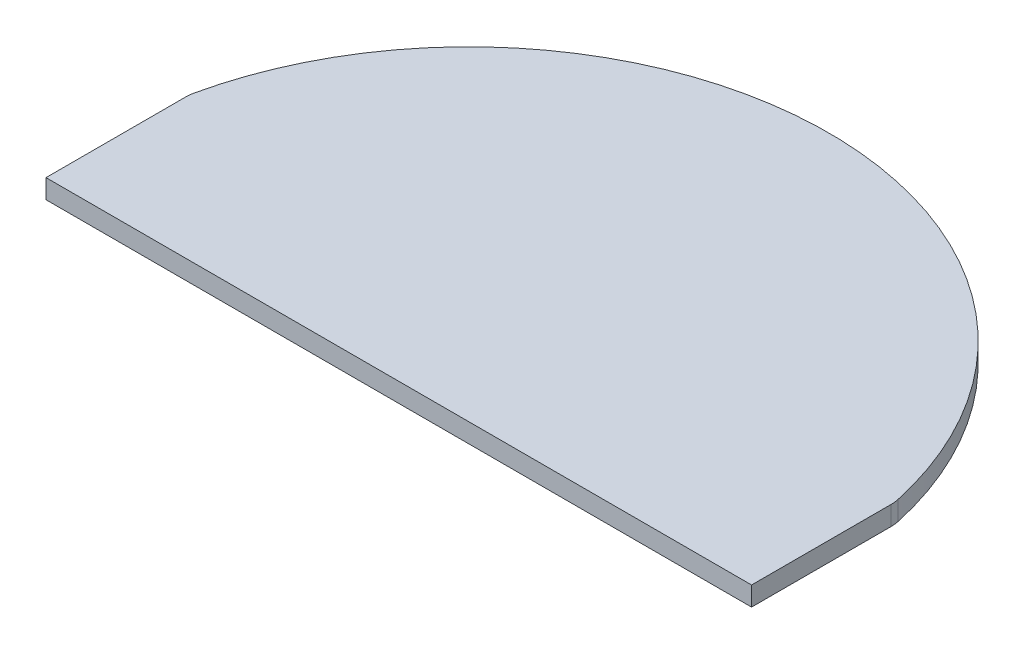
ISO-10303-21;
HEADER;
FILE_DESCRIPTION(('STEP AP214'),'2;1');
FILE_NAME('part.step','',(''),(''),'','','');
FILE_SCHEMA(('AUTOMOTIVE_DESIGN { 1 0 10303 214 1 1 1 1 }'));
ENDSEC;
DATA;
#1=APPLICATION_CONTEXT('core data for automotive mechanical design processes');
#2=APPLICATION_PROTOCOL_DEFINITION('international standard','automotive_design',2000,#1);
#3=PRODUCT_CONTEXT('',#1,'mechanical');
#4=PRODUCT('Part','Part','',(#3));
#5=PRODUCT_RELATED_PRODUCT_CATEGORY('part','',(#4));
#6=PRODUCT_DEFINITION_FORMATION('','',#4);
#7=PRODUCT_DEFINITION_CONTEXT('part definition',#1,'design');
#8=PRODUCT_DEFINITION('design','',#6,#7);
#9=PRODUCT_DEFINITION_SHAPE('','',#8);
#10=(LENGTH_UNIT() NAMED_UNIT(*) SI_UNIT(.MILLI.,.METRE.));
#11=(NAMED_UNIT(*) PLANE_ANGLE_UNIT() SI_UNIT($,.RADIAN.));
#12=(NAMED_UNIT(*) SI_UNIT($,.STERADIAN.) SOLID_ANGLE_UNIT());
#13=UNCERTAINTY_MEASURE_WITH_UNIT(LENGTH_MEASURE(1.E-05),#10,'distance_accuracy_value','');
#14=(GEOMETRIC_REPRESENTATION_CONTEXT(3) GLOBAL_UNCERTAINTY_ASSIGNED_CONTEXT((#13)) GLOBAL_UNIT_ASSIGNED_CONTEXT((#10,
#11,#12)) REPRESENTATION_CONTEXT('',''));
#15=CARTESIAN_POINT('',(0.,0.,0.));
#16=DIRECTION('',(0.,0.,1.));
#17=DIRECTION('',(1.,0.,0.));
#18=AXIS2_PLACEMENT_3D('',#15,#16,#17);
#19=CARTESIAN_POINT('',(0.,6.8,0.));
#20=DIRECTION('',(1.,0.,0.));
#21=DIRECTION('',(0.,0.,-1.));
#22=AXIS2_PLACEMENT_3D('',#19,#20,#21);
#23=PLANE('',#22);
#24=DIRECTION('',(0.,0.,1.));
#25=VECTOR('',#24,1.);
#26=CARTESIAN_POINT('',(0.,6.8,0.));
#27=LINE('',#26,#25);
#28=CARTESIAN_POINT('',(0.,6.8,-49.4538015265581));
#29=VERTEX_POINT('',#28);
#30=CARTESIAN_POINT('',(0.,6.8,0.));
#31=VERTEX_POINT('',#30);
#32=EDGE_CURVE('E86',#29,#31,#27,.T.);
#33=ORIENTED_EDGE('',*,*,#32,.F.);
#34=DIRECTION('',(0.,-1.,0.));
#35=VECTOR('',#34,1.);
#36=CARTESIAN_POINT('',(0.,6.8,-49.4538015265581));
#37=LINE('',#36,#35);
#38=CARTESIAN_POINT('',(0.,0.,-49.4538015265581));
#39=VERTEX_POINT('',#38);
#40=EDGE_CURVE('E11',#29,#39,#37,.T.);
#41=ORIENTED_EDGE('',*,*,#40,.T.);
#42=DIRECTION('',(0.,0.,1.));
#43=VECTOR('',#42,1.);
#44=CARTESIAN_POINT('',(0.,0.,0.));
#45=LINE('',#44,#43);
#46=CARTESIAN_POINT('',(0.,0.,0.));
#47=VERTEX_POINT('',#46);
#48=EDGE_CURVE('E105',#39,#47,#45,.T.);
#49=ORIENTED_EDGE('',*,*,#48,.T.);
#50=DIRECTION('',(0.,-1.,0.));
#51=VECTOR('',#50,1.);
#52=CARTESIAN_POINT('',(0.,6.8,0.));
#53=LINE('',#52,#51);
#54=EDGE_CURVE('E99',#31,#47,#53,.T.);
#55=ORIENTED_EDGE('',*,*,#54,.F.);
#56=EDGE_LOOP('',(#33,#41,#49,#55));
#57=FACE_BOUND('',#56,.T.);
#58=ADVANCED_FACE('F33',(#57),#23,.F.);
#59=CARTESIAN_POINT('',(0.,6.8,0.));
#60=DIRECTION('',(0.,0.,-1.));
#61=DIRECTION('',(-1.,0.,0.));
#62=AXIS2_PLACEMENT_3D('',#59,#60,#61);
#63=PLANE('',#62);
#64=DIRECTION('',(1.,0.,0.));
#65=VECTOR('',#64,1.);
#66=CARTESIAN_POINT('',(0.,0.,0.));
#67=LINE('',#66,#65);
#68=CARTESIAN_POINT('',(250.,0.,0.));
#69=VERTEX_POINT('',#68);
#70=EDGE_CURVE('E138',#47,#69,#67,.T.);
#71=ORIENTED_EDGE('',*,*,#70,.T.);
#72=DIRECTION('',(0.,-1.,0.));
#73=VECTOR('',#72,1.);
#74=CARTESIAN_POINT('',(250.,6.8,0.));
#75=LINE('',#74,#73);
#76=CARTESIAN_POINT('',(250.,6.8,0.));
#77=VERTEX_POINT('',#76);
#78=EDGE_CURVE('E101',#77,#69,#75,.T.);
#79=ORIENTED_EDGE('',*,*,#78,.F.);
#80=DIRECTION('',(1.,0.,0.));
#81=VECTOR('',#80,1.);
#82=CARTESIAN_POINT('',(0.,6.8,0.));
#83=LINE('',#82,#81);
#84=EDGE_CURVE('E89',#31,#77,#83,.T.);
#85=ORIENTED_EDGE('',*,*,#84,.F.);
#86=ORIENTED_EDGE('',*,*,#54,.T.);
#87=EDGE_LOOP('',(#71,#79,#85,#86));
#88=FACE_BOUND('',#87,.T.);
#89=ADVANCED_FACE('F98',(#88),#63,.F.);
#90=CARTESIAN_POINT('',(250.,6.8,0.));
#91=DIRECTION('',(-1.,0.,0.));
#92=DIRECTION('',(0.,0.,1.));
#93=AXIS2_PLACEMENT_3D('',#90,#91,#92);
#94=PLANE('',#93);
#95=DIRECTION('',(0.,0.,-1.));
#96=VECTOR('',#95,1.);
#97=CARTESIAN_POINT('',(250.,0.,0.));
#98=LINE('',#97,#96);
#99=CARTESIAN_POINT('',(250.,0.,-49.453801526558));
#100=VERTEX_POINT('',#99);
#101=EDGE_CURVE('E136',#69,#100,#98,.T.);
#102=ORIENTED_EDGE('',*,*,#101,.T.);
#103=DIRECTION('',(0.,-1.,0.));
#104=VECTOR('',#103,1.);
#105=CARTESIAN_POINT('',(250.,6.8,-49.453801526558));
#106=LINE('',#105,#104);
#107=CARTESIAN_POINT('',(250.,6.8,-49.453801526558));
#108=VERTEX_POINT('',#107);
#109=EDGE_CURVE('E56',#100,#108,#106,.F.);
#110=ORIENTED_EDGE('',*,*,#109,.T.);
#111=DIRECTION('',(0.,0.,-1.));
#112=VECTOR('',#111,1.);
#113=CARTESIAN_POINT('',(250.,6.8,0.));
#114=LINE('',#113,#112);
#115=EDGE_CURVE('E102',#77,#108,#114,.T.);
#116=ORIENTED_EDGE('',*,*,#115,.F.);
#117=ORIENTED_EDGE('',*,*,#78,.T.);
#118=EDGE_LOOP('',(#102,#110,#116,#117));
#119=FACE_BOUND('',#118,.T.);
#120=ADVANCED_FACE('F137',(#119),#94,.F.);
#121=CARTESIAN_POINT('',(125.,6.8,-24.7053149606299));
#122=DIRECTION('',(0.,-1.,0.));
#123=DIRECTION('',(0.,0.,-1.));
#124=AXIS2_PLACEMENT_3D('',#121,#122,#123);
#125=CYLINDRICAL_SURFACE('',#124,127.69468503937);
#126=CARTESIAN_POINT('',(125.,6.8,-24.7053149606299));
#127=DIRECTION('',(0.,1.,0.));
#128=DIRECTION('',(0.,0.,-1.));
#129=AXIS2_PLACEMENT_3D('',#126,#127,#128);
#130=CIRCLE('',#129,127.69468503937);
#131=CARTESIAN_POINT('',(249.702399289252,6.8,-52.1870215817256));
#132=VERTEX_POINT('',#131);
#133=CARTESIAN_POINT('',(0.297600710748358,6.8,-52.1870215817257));
#134=VERTEX_POINT('',#133);
#135=EDGE_CURVE('E111',#132,#134,#130,.T.);
#136=ORIENTED_EDGE('',*,*,#135,.F.);
#137=DIRECTION('',(0.,-1.,0.));
#138=VECTOR('',#137,1.);
#139=CARTESIAN_POINT('',(249.702399289252,6.8,-52.1870215817256));
#140=LINE('',#139,#138);
#141=CARTESIAN_POINT('',(249.702399289252,0.,-52.1870215817256));
#142=VERTEX_POINT('',#141);
#143=EDGE_CURVE('E109',#132,#142,#140,.T.);
#144=ORIENTED_EDGE('',*,*,#143,.T.);
#145=CARTESIAN_POINT('',(125.,0.,-24.7053149606299));
#146=DIRECTION('',(0.,1.,0.));
#147=DIRECTION('',(0.,0.,-1.));
#148=AXIS2_PLACEMENT_3D('',#145,#146,#147);
#149=CIRCLE('',#148,127.69468503937);
#150=CARTESIAN_POINT('',(0.297600710748358,0.,-52.1870215817257));
#151=VERTEX_POINT('',#150);
#152=EDGE_CURVE('E94',#142,#151,#149,.T.);
#153=ORIENTED_EDGE('',*,*,#152,.T.);
#154=DIRECTION('',(0.,-1.,0.));
#155=VECTOR('',#154,1.);
#156=CARTESIAN_POINT('',(0.297600710748358,6.8,-52.1870215817257));
#157=LINE('',#156,#155);
#158=EDGE_CURVE('E107',#151,#134,#157,.F.);
#159=ORIENTED_EDGE('',*,*,#158,.T.);
#160=EDGE_LOOP('',(#136,#144,#153,#159));
#161=FACE_BOUND('',#160,.T.);
#162=ADVANCED_FACE('F127',(#161),#125,.T.);
#163=CARTESIAN_POINT('',(125.,6.8,-24.7053149606299));
#164=DIRECTION('',(0.,-1.,0.));
#165=DIRECTION('',(0.,0.,-1.));
#166=AXIS2_PLACEMENT_3D('',#163,#164,#165);
#167=PLANE('',#166);
#168=ORIENTED_EDGE('',*,*,#115,.T.);
#169=CARTESIAN_POINT('',(237.3,6.8,-49.453801526558));
#170=DIRECTION('',(0.,-1.,0.));
#171=DIRECTION('',(0.,0.,-1.));
#172=AXIS2_PLACEMENT_3D('',#169,#170,#171);
#173=CIRCLE('',#172,12.7);
#174=EDGE_CURVE('E41',#108,#132,#173,.F.);
#175=ORIENTED_EDGE('',*,*,#174,.T.);
#176=ORIENTED_EDGE('',*,*,#135,.T.);
#177=CARTESIAN_POINT('',(12.7,6.8,-49.4538015265581));
#178=DIRECTION('',(0.,-1.,0.));
#179=DIRECTION('',(0.,0.,-1.));
#180=AXIS2_PLACEMENT_3D('',#177,#178,#179);
#181=CIRCLE('',#180,12.7);
#182=EDGE_CURVE('E48',#134,#29,#181,.F.);
#183=ORIENTED_EDGE('',*,*,#182,.T.);
#184=ORIENTED_EDGE('',*,*,#32,.T.);
#185=ORIENTED_EDGE('',*,*,#84,.T.);
#186=EDGE_LOOP('',(#168,#175,#176,#183,#184,#185));
#187=FACE_BOUND('',#186,.T.);
#188=ADVANCED_FACE('F88',(#187),#167,.F.);
#189=CARTESIAN_POINT('',(125.,0.,-24.7053149606299));
#190=DIRECTION('',(0.,-1.,0.));
#191=DIRECTION('',(0.,0.,-1.));
#192=AXIS2_PLACEMENT_3D('',#189,#190,#191);
#193=PLANE('',#192);
#194=ORIENTED_EDGE('',*,*,#152,.F.);
#195=CARTESIAN_POINT('',(237.3,0.,-49.453801526558));
#196=DIRECTION('',(0.,-1.,0.));
#197=DIRECTION('',(0.,0.,-1.));
#198=AXIS2_PLACEMENT_3D('',#195,#196,#197);
#199=CIRCLE('',#198,12.7);
#200=EDGE_CURVE('E119',#142,#100,#199,.T.);
#201=ORIENTED_EDGE('',*,*,#200,.T.);
#202=ORIENTED_EDGE('',*,*,#101,.F.);
#203=ORIENTED_EDGE('',*,*,#70,.F.);
#204=ORIENTED_EDGE('',*,*,#48,.F.);
#205=CARTESIAN_POINT('',(12.7,0.,-49.4538015265581));
#206=DIRECTION('',(0.,-1.,0.));
#207=DIRECTION('',(0.,0.,-1.));
#208=AXIS2_PLACEMENT_3D('',#205,#206,#207);
#209=CIRCLE('',#208,12.7);
#210=EDGE_CURVE('E117',#39,#151,#209,.T.);
#211=ORIENTED_EDGE('',*,*,#210,.T.);
#212=EDGE_LOOP('',(#194,#201,#202,#203,#204,#211));
#213=FACE_BOUND('',#212,.T.);
#214=ADVANCED_FACE('F135',(#213),#193,.T.);
#215=CARTESIAN_POINT('',(237.3,6.8,-49.453801526558));
#216=DIRECTION('',(0.,-1.,0.));
#217=DIRECTION('',(0.,0.,-1.));
#218=AXIS2_PLACEMENT_3D('',#215,#216,#217);
#219=CYLINDRICAL_SURFACE('',#218,12.7);
#220=ORIENTED_EDGE('',*,*,#174,.F.);
#221=ORIENTED_EDGE('',*,*,#109,.F.);
#222=ORIENTED_EDGE('',*,*,#200,.F.);
#223=ORIENTED_EDGE('',*,*,#143,.F.);
#224=EDGE_LOOP('',(#220,#221,#222,#223));
#225=FACE_BOUND('',#224,.T.);
#226=ADVANCED_FACE('F132',(#225),#219,.T.);
#227=CARTESIAN_POINT('',(12.7,6.8,-49.4538015265581));
#228=DIRECTION('',(0.,-1.,0.));
#229=DIRECTION('',(0.,0.,-1.));
#230=AXIS2_PLACEMENT_3D('',#227,#228,#229);
#231=CYLINDRICAL_SURFACE('',#230,12.7);
#232=ORIENTED_EDGE('',*,*,#182,.F.);
#233=ORIENTED_EDGE('',*,*,#158,.F.);
#234=ORIENTED_EDGE('',*,*,#210,.F.);
#235=ORIENTED_EDGE('',*,*,#40,.F.);
#236=EDGE_LOOP('',(#232,#233,#234,#235));
#237=FACE_BOUND('',#236,.T.);
#238=ADVANCED_FACE('F35',(#237),#231,.T.);
#239=CLOSED_SHELL('',(#58,#89,#120,#162,#188,#214,#226,#238));
#240=MANIFOLD_SOLID_BREP('B2',#239);
#241=ADVANCED_BREP_SHAPE_REPRESENTATION('',(#18,#240),#14);
#242=SHAPE_DEFINITION_REPRESENTATION(#9,#241);
ENDSEC;
END-ISO-10303-21;
